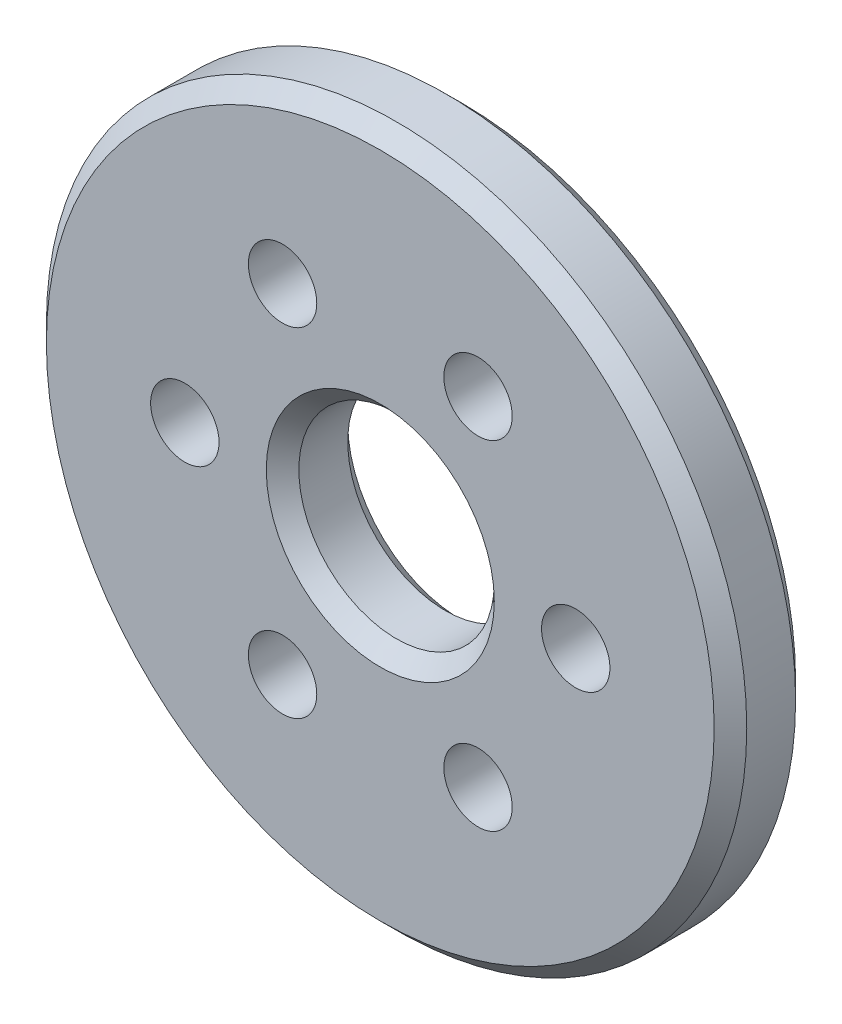
ISO-10303-21;
HEADER;
FILE_DESCRIPTION(('STEP AP214'),'2;1');
FILE_NAME('part.step','',(''),(''),'','','');
FILE_SCHEMA(('AUTOMOTIVE_DESIGN { 1 0 10303 214 1 1 1 1 }'));
ENDSEC;
DATA;
#1=APPLICATION_CONTEXT('core data for automotive mechanical design processes');
#2=APPLICATION_PROTOCOL_DEFINITION('international standard','automotive_design',2000,#1);
#3=PRODUCT_CONTEXT('',#1,'mechanical');
#4=PRODUCT('Part','Part','',(#3));
#5=PRODUCT_RELATED_PRODUCT_CATEGORY('part','',(#4));
#6=PRODUCT_DEFINITION_FORMATION('','',#4);
#7=PRODUCT_DEFINITION_CONTEXT('part definition',#1,'design');
#8=PRODUCT_DEFINITION('design','',#6,#7);
#9=PRODUCT_DEFINITION_SHAPE('','',#8);
#10=(LENGTH_UNIT() NAMED_UNIT(*) SI_UNIT(.MILLI.,.METRE.));
#11=(NAMED_UNIT(*) PLANE_ANGLE_UNIT() SI_UNIT($,.RADIAN.));
#12=(NAMED_UNIT(*) SI_UNIT($,.STERADIAN.) SOLID_ANGLE_UNIT());
#13=UNCERTAINTY_MEASURE_WITH_UNIT(LENGTH_MEASURE(1.E-05),#10,'distance_accuracy_value','');
#14=(GEOMETRIC_REPRESENTATION_CONTEXT(3) GLOBAL_UNCERTAINTY_ASSIGNED_CONTEXT((#13)) GLOBAL_UNIT_ASSIGNED_CONTEXT((#10,
#11,#12)) REPRESENTATION_CONTEXT('',''));
#15=CARTESIAN_POINT('',(0.,0.,0.));
#16=DIRECTION('',(0.,0.,1.));
#17=DIRECTION('',(1.,0.,0.));
#18=AXIS2_PLACEMENT_3D('',#15,#16,#17);
#19=CARTESIAN_POINT('',(0.,0.,5.));
#20=DIRECTION('',(0.,0.,1.));
#21=DIRECTION('',(1.,0.,0.));
#22=AXIS2_PLACEMENT_3D('',#19,#20,#21);
#23=PLANE('',#22);
#24=CARTESIAN_POINT('',(0.,0.,5.));
#25=DIRECTION('',(0.,0.,1.));
#26=DIRECTION('',(1.,0.,0.));
#27=AXIS2_PLACEMENT_3D('',#24,#25,#26);
#28=CIRCLE('',#27,7.00000000000001);
#29=CARTESIAN_POINT('',(7.00000000000001,0.,5.));
#30=VERTEX_POINT('',#29);
#31=EDGE_CURVE('E61',#30,#30,#28,.F.);
#32=ORIENTED_EDGE('',*,*,#31,.T.);
#33=EDGE_LOOP('',(#32));
#34=FACE_BOUND('',#33,.T.);
#35=CARTESIAN_POINT('',(0.,0.,5.));
#36=DIRECTION('',(0.,0.,1.));
#37=DIRECTION('',(1.,0.,0.));
#38=AXIS2_PLACEMENT_3D('',#35,#36,#37);
#39=CIRCLE('',#38,20.5);
#40=CARTESIAN_POINT('',(20.5,0.,5.));
#41=VERTEX_POINT('',#40);
#42=EDGE_CURVE('E67',#41,#41,#39,.T.);
#43=ORIENTED_EDGE('',*,*,#42,.T.);
#44=EDGE_LOOP('',(#43));
#45=FACE_BOUND('',#44,.T.);
#46=CARTESIAN_POINT('',(-5.9999999999999,10.3923048454133,5.));
#47=DIRECTION('',(0.,0.,1.));
#48=DIRECTION('',(1.,0.,0.));
#49=AXIS2_PLACEMENT_3D('',#46,#47,#48);
#50=CIRCLE('',#49,2.1);
#51=CARTESIAN_POINT('',(-3.89999999999991,10.3923048454133,5.));
#52=VERTEX_POINT('',#51);
#53=EDGE_CURVE('E116',#52,#52,#50,.T.);
#54=ORIENTED_EDGE('',*,*,#53,.F.);
#55=EDGE_LOOP('',(#54));
#56=FACE_BOUND('',#55,.T.);
#57=CARTESIAN_POINT('',(-6.00000000000005,-10.3923048454132,5.));
#58=DIRECTION('',(0.,0.,1.));
#59=DIRECTION('',(1.,0.,0.));
#60=AXIS2_PLACEMENT_3D('',#57,#58,#59);
#61=CIRCLE('',#60,2.1);
#62=CARTESIAN_POINT('',(-3.90000000000005,-10.3923048454132,5.));
#63=VERTEX_POINT('',#62);
#64=EDGE_CURVE('E101',#63,#63,#61,.T.);
#65=ORIENTED_EDGE('',*,*,#64,.F.);
#66=EDGE_LOOP('',(#65));
#67=FACE_BOUND('',#66,.T.);
#68=CARTESIAN_POINT('',(12.,0.,5.));
#69=DIRECTION('',(0.,0.,1.));
#70=DIRECTION('',(1.,0.,0.));
#71=AXIS2_PLACEMENT_3D('',#68,#69,#70);
#72=CIRCLE('',#71,2.1);
#73=CARTESIAN_POINT('',(14.1,0.,5.));
#74=VERTEX_POINT('',#73);
#75=EDGE_CURVE('E88',#74,#74,#72,.T.);
#76=ORIENTED_EDGE('',*,*,#75,.F.);
#77=EDGE_LOOP('',(#76));
#78=FACE_BOUND('',#77,.T.);
#79=CARTESIAN_POINT('',(5.99999999999998,-10.3923048454133,5.));
#80=DIRECTION('',(0.,0.,1.));
#81=DIRECTION('',(1.,0.,0.));
#82=AXIS2_PLACEMENT_3D('',#79,#80,#81);
#83=CIRCLE('',#82,2.1);
#84=CARTESIAN_POINT('',(8.09999999999997,-10.3923048454133,5.));
#85=VERTEX_POINT('',#84);
#86=EDGE_CURVE('E93',#85,#85,#83,.T.);
#87=ORIENTED_EDGE('',*,*,#86,.F.);
#88=EDGE_LOOP('',(#87));
#89=FACE_BOUND('',#88,.T.);
#90=CARTESIAN_POINT('',(-12.,0.,5.));
#91=DIRECTION('',(0.,0.,1.));
#92=DIRECTION('',(1.,0.,0.));
#93=AXIS2_PLACEMENT_3D('',#90,#91,#92);
#94=CIRCLE('',#93,2.1);
#95=CARTESIAN_POINT('',(-9.9,0.,5.));
#96=VERTEX_POINT('',#95);
#97=EDGE_CURVE('E108',#96,#96,#94,.T.);
#98=ORIENTED_EDGE('',*,*,#97,.F.);
#99=EDGE_LOOP('',(#98));
#100=FACE_BOUND('',#99,.T.);
#101=CARTESIAN_POINT('',(6.00000000000012,10.3923048454132,5.));
#102=DIRECTION('',(0.,0.,1.));
#103=DIRECTION('',(1.,0.,0.));
#104=AXIS2_PLACEMENT_3D('',#101,#102,#103);
#105=CIRCLE('',#104,2.1);
#106=CARTESIAN_POINT('',(8.10000000000012,10.3923048454132,5.));
#107=VERTEX_POINT('',#106);
#108=EDGE_CURVE('E124',#107,#107,#105,.T.);
#109=ORIENTED_EDGE('',*,*,#108,.F.);
#110=EDGE_LOOP('',(#109));
#111=FACE_BOUND('',#110,.T.);
#112=ADVANCED_FACE('F45',(#34,#45,#56,#67,#78,#89,#100,#111),#23,.T.);
#113=CARTESIAN_POINT('',(0.,0.,0.));
#114=DIRECTION('',(0.,0.,1.));
#115=DIRECTION('',(1.,0.,0.));
#116=AXIS2_PLACEMENT_3D('',#113,#114,#115);
#117=PLANE('',#116);
#118=CARTESIAN_POINT('',(0.,0.,0.));
#119=DIRECTION('',(0.,0.,1.));
#120=DIRECTION('',(1.,0.,0.));
#121=AXIS2_PLACEMENT_3D('',#118,#119,#120);
#122=CIRCLE('',#121,7.);
#123=CARTESIAN_POINT('',(7.,0.,0.));
#124=VERTEX_POINT('',#123);
#125=EDGE_CURVE('E80',#124,#124,#122,.T.);
#126=ORIENTED_EDGE('',*,*,#125,.T.);
#127=EDGE_LOOP('',(#126));
#128=FACE_BOUND('',#127,.T.);
#129=CARTESIAN_POINT('',(0.,0.,0.));
#130=DIRECTION('',(0.,0.,1.));
#131=DIRECTION('',(1.,0.,0.));
#132=AXIS2_PLACEMENT_3D('',#129,#130,#131);
#133=CIRCLE('',#132,20.5);
#134=CARTESIAN_POINT('',(20.5,0.,0.));
#135=VERTEX_POINT('',#134);
#136=EDGE_CURVE('E84',#135,#135,#133,.F.);
#137=ORIENTED_EDGE('',*,*,#136,.T.);
#138=EDGE_LOOP('',(#137));
#139=FACE_BOUND('',#138,.T.);
#140=CARTESIAN_POINT('',(12.,0.,0.));
#141=DIRECTION('',(0.,0.,1.));
#142=DIRECTION('',(1.,0.,0.));
#143=AXIS2_PLACEMENT_3D('',#140,#141,#142);
#144=CIRCLE('',#143,2.1);
#145=CARTESIAN_POINT('',(14.1,0.,0.));
#146=VERTEX_POINT('',#145);
#147=EDGE_CURVE('E89',#146,#146,#144,.T.);
#148=ORIENTED_EDGE('',*,*,#147,.T.);
#149=EDGE_LOOP('',(#148));
#150=FACE_BOUND('',#149,.T.);
#151=CARTESIAN_POINT('',(5.99999999999998,-10.3923048454133,0.));
#152=DIRECTION('',(0.,0.,1.));
#153=DIRECTION('',(1.,0.,0.));
#154=AXIS2_PLACEMENT_3D('',#151,#152,#153);
#155=CIRCLE('',#154,2.1);
#156=CARTESIAN_POINT('',(8.09999999999997,-10.3923048454133,0.));
#157=VERTEX_POINT('',#156);
#158=EDGE_CURVE('E97',#157,#157,#155,.T.);
#159=ORIENTED_EDGE('',*,*,#158,.T.);
#160=EDGE_LOOP('',(#159));
#161=FACE_BOUND('',#160,.T.);
#162=CARTESIAN_POINT('',(-6.00000000000005,-10.3923048454132,0.));
#163=DIRECTION('',(0.,0.,1.));
#164=DIRECTION('',(1.,0.,0.));
#165=AXIS2_PLACEMENT_3D('',#162,#163,#164);
#166=CIRCLE('',#165,2.1);
#167=CARTESIAN_POINT('',(-3.90000000000005,-10.3923048454132,0.));
#168=VERTEX_POINT('',#167);
#169=EDGE_CURVE('E104',#168,#168,#166,.T.);
#170=ORIENTED_EDGE('',*,*,#169,.T.);
#171=EDGE_LOOP('',(#170));
#172=FACE_BOUND('',#171,.T.);
#173=CARTESIAN_POINT('',(-12.,0.,0.));
#174=DIRECTION('',(0.,0.,1.));
#175=DIRECTION('',(1.,0.,0.));
#176=AXIS2_PLACEMENT_3D('',#173,#174,#175);
#177=CIRCLE('',#176,2.1);
#178=CARTESIAN_POINT('',(-9.9,0.,0.));
#179=VERTEX_POINT('',#178);
#180=EDGE_CURVE('E112',#179,#179,#177,.T.);
#181=ORIENTED_EDGE('',*,*,#180,.T.);
#182=EDGE_LOOP('',(#181));
#183=FACE_BOUND('',#182,.T.);
#184=CARTESIAN_POINT('',(-5.9999999999999,10.3923048454133,0.));
#185=DIRECTION('',(0.,0.,1.));
#186=DIRECTION('',(1.,0.,0.));
#187=AXIS2_PLACEMENT_3D('',#184,#185,#186);
#188=CIRCLE('',#187,2.1);
#189=CARTESIAN_POINT('',(-3.89999999999991,10.3923048454133,0.));
#190=VERTEX_POINT('',#189);
#191=EDGE_CURVE('E120',#190,#190,#188,.T.);
#192=ORIENTED_EDGE('',*,*,#191,.T.);
#193=EDGE_LOOP('',(#192));
#194=FACE_BOUND('',#193,.T.);
#195=CARTESIAN_POINT('',(6.00000000000012,10.3923048454132,0.));
#196=DIRECTION('',(0.,0.,1.));
#197=DIRECTION('',(1.,0.,0.));
#198=AXIS2_PLACEMENT_3D('',#195,#196,#197);
#199=CIRCLE('',#198,2.1);
#200=CARTESIAN_POINT('',(8.10000000000012,10.3923048454132,0.));
#201=VERTEX_POINT('',#200);
#202=EDGE_CURVE('E127',#201,#201,#199,.T.);
#203=ORIENTED_EDGE('',*,*,#202,.T.);
#204=EDGE_LOOP('',(#203));
#205=FACE_BOUND('',#204,.T.);
#206=ADVANCED_FACE('F139',(#128,#139,#150,#161,#172,#183,#194,#205),#117,.F.);
#207=CARTESIAN_POINT('',(0.,0.,5.));
#208=DIRECTION('',(0.,0.,-1.));
#209=DIRECTION('',(-1.,0.,0.));
#210=AXIS2_PLACEMENT_3D('',#207,#208,#209);
#211=CYLINDRICAL_SURFACE('',#210,21.5);
#212=CARTESIAN_POINT('',(0.,0.,1.));
#213=DIRECTION('',(0.,0.,1.));
#214=DIRECTION('',(1.,0.,0.));
#215=AXIS2_PLACEMENT_3D('',#212,#213,#214);
#216=CIRCLE('',#215,21.5);
#217=CARTESIAN_POINT('',(21.5,0.,1.));
#218=VERTEX_POINT('',#217);
#219=EDGE_CURVE('E10',#218,#218,#216,.T.);
#220=ORIENTED_EDGE('',*,*,#219,.T.);
#221=EDGE_LOOP('',(#220));
#222=FACE_BOUND('',#221,.T.);
#223=CARTESIAN_POINT('',(0.,0.,4.00000000000001));
#224=DIRECTION('',(0.,0.,1.));
#225=DIRECTION('',(1.,0.,0.));
#226=AXIS2_PLACEMENT_3D('',#223,#224,#225);
#227=CIRCLE('',#226,21.5);
#228=CARTESIAN_POINT('',(21.5,0.,4.00000000000001));
#229=VERTEX_POINT('',#228);
#230=EDGE_CURVE('E54',#229,#229,#227,.F.);
#231=ORIENTED_EDGE('',*,*,#230,.T.);
#232=EDGE_LOOP('',(#231));
#233=FACE_BOUND('',#232,.T.);
#234=ADVANCED_FACE('F144',(#222,#233),#211,.T.);
#235=CARTESIAN_POINT('',(12.,0.,5.));
#236=DIRECTION('',(0.,0.,-1.));
#237=DIRECTION('',(-1.,0.,0.));
#238=AXIS2_PLACEMENT_3D('',#235,#236,#237);
#239=CYLINDRICAL_SURFACE('',#238,2.1);
#240=ORIENTED_EDGE('',*,*,#75,.T.);
#241=EDGE_LOOP('',(#240));
#242=FACE_BOUND('',#241,.T.);
#243=ORIENTED_EDGE('',*,*,#147,.F.);
#244=EDGE_LOOP('',(#243));
#245=FACE_BOUND('',#244,.T.);
#246=ADVANCED_FACE('F149',(#242,#245),#239,.F.);
#247=CARTESIAN_POINT('',(0.,0.,5.));
#248=DIRECTION('',(0.,0.,-1.));
#249=DIRECTION('',(-1.,0.,0.));
#250=AXIS2_PLACEMENT_3D('',#247,#248,#249);
#251=CYLINDRICAL_SURFACE('',#250,6.);
#252=CARTESIAN_POINT('',(0.,0.,0.999999999999997));
#253=DIRECTION('',(0.,0.,1.));
#254=DIRECTION('',(1.,0.,0.));
#255=AXIS2_PLACEMENT_3D('',#252,#253,#254);
#256=CIRCLE('',#255,6.);
#257=CARTESIAN_POINT('',(6.,0.,0.999999999999997));
#258=VERTEX_POINT('',#257);
#259=EDGE_CURVE('E73',#258,#258,#256,.F.);
#260=ORIENTED_EDGE('',*,*,#259,.T.);
#261=EDGE_LOOP('',(#260));
#262=FACE_BOUND('',#261,.T.);
#263=CARTESIAN_POINT('',(0.,0.,4.));
#264=DIRECTION('',(0.,0.,1.));
#265=DIRECTION('',(1.,0.,0.));
#266=AXIS2_PLACEMENT_3D('',#263,#264,#265);
#267=CIRCLE('',#266,6.);
#268=CARTESIAN_POINT('',(6.,0.,4.));
#269=VERTEX_POINT('',#268);
#270=EDGE_CURVE('E76',#269,#269,#267,.T.);
#271=ORIENTED_EDGE('',*,*,#270,.T.);
#272=EDGE_LOOP('',(#271));
#273=FACE_BOUND('',#272,.T.);
#274=ADVANCED_FACE('F209',(#262,#273),#251,.F.);
#275=CARTESIAN_POINT('',(5.99999999999998,-10.3923048454133,5.));
#276=DIRECTION('',(0.,0.,-1.));
#277=DIRECTION('',(-1.,0.,0.));
#278=AXIS2_PLACEMENT_3D('',#275,#276,#277);
#279=CYLINDRICAL_SURFACE('',#278,2.1);
#280=ORIENTED_EDGE('',*,*,#86,.T.);
#281=EDGE_LOOP('',(#280));
#282=FACE_BOUND('',#281,.T.);
#283=ORIENTED_EDGE('',*,*,#158,.F.);
#284=EDGE_LOOP('',(#283));
#285=FACE_BOUND('',#284,.T.);
#286=ADVANCED_FACE('F206',(#282,#285),#279,.F.);
#287=CARTESIAN_POINT('',(-6.00000000000005,-10.3923048454132,5.));
#288=DIRECTION('',(0.,0.,-1.));
#289=DIRECTION('',(-1.,0.,0.));
#290=AXIS2_PLACEMENT_3D('',#287,#288,#289);
#291=CYLINDRICAL_SURFACE('',#290,2.1);
#292=ORIENTED_EDGE('',*,*,#64,.T.);
#293=EDGE_LOOP('',(#292));
#294=FACE_BOUND('',#293,.T.);
#295=ORIENTED_EDGE('',*,*,#169,.F.);
#296=EDGE_LOOP('',(#295));
#297=FACE_BOUND('',#296,.T.);
#298=ADVANCED_FACE('F202',(#294,#297),#291,.F.);
#299=CARTESIAN_POINT('',(-12.,0.,5.));
#300=DIRECTION('',(0.,0.,-1.));
#301=DIRECTION('',(-1.,0.,0.));
#302=AXIS2_PLACEMENT_3D('',#299,#300,#301);
#303=CYLINDRICAL_SURFACE('',#302,2.1);
#304=ORIENTED_EDGE('',*,*,#97,.T.);
#305=EDGE_LOOP('',(#304));
#306=FACE_BOUND('',#305,.T.);
#307=ORIENTED_EDGE('',*,*,#180,.F.);
#308=EDGE_LOOP('',(#307));
#309=FACE_BOUND('',#308,.T.);
#310=ADVANCED_FACE('F196',(#306,#309),#303,.F.);
#311=CARTESIAN_POINT('',(-5.9999999999999,10.3923048454133,5.));
#312=DIRECTION('',(0.,0.,-1.));
#313=DIRECTION('',(-1.,0.,0.));
#314=AXIS2_PLACEMENT_3D('',#311,#312,#313);
#315=CYLINDRICAL_SURFACE('',#314,2.1);
#316=ORIENTED_EDGE('',*,*,#53,.T.);
#317=EDGE_LOOP('',(#316));
#318=FACE_BOUND('',#317,.T.);
#319=ORIENTED_EDGE('',*,*,#191,.F.);
#320=EDGE_LOOP('',(#319));
#321=FACE_BOUND('',#320,.T.);
#322=ADVANCED_FACE('F192',(#318,#321),#315,.F.);
#323=CARTESIAN_POINT('',(6.00000000000012,10.3923048454132,5.));
#324=DIRECTION('',(0.,0.,-1.));
#325=DIRECTION('',(-1.,0.,0.));
#326=AXIS2_PLACEMENT_3D('',#323,#324,#325);
#327=CYLINDRICAL_SURFACE('',#326,2.1);
#328=ORIENTED_EDGE('',*,*,#108,.T.);
#329=EDGE_LOOP('',(#328));
#330=FACE_BOUND('',#329,.T.);
#331=ORIENTED_EDGE('',*,*,#202,.F.);
#332=EDGE_LOOP('',(#331));
#333=FACE_BOUND('',#332,.T.);
#334=ADVANCED_FACE('F135',(#330,#333),#327,.F.);
#335=CARTESIAN_POINT('',(0.,0.,0.));
#336=DIRECTION('',(0.,0.,-1.));
#337=DIRECTION('',(-1.,0.,0.));
#338=AXIS2_PLACEMENT_3D('',#335,#336,#337);
#339=CONICAL_SURFACE('',#338,7.,0.785398163397449);
#340=ORIENTED_EDGE('',*,*,#259,.F.);
#341=EDGE_LOOP('',(#340));
#342=FACE_BOUND('',#341,.T.);
#343=ORIENTED_EDGE('',*,*,#125,.F.);
#344=EDGE_LOOP('',(#343));
#345=FACE_BOUND('',#344,.T.);
#346=ADVANCED_FACE('F155',(#342,#345),#339,.F.);
#347=CARTESIAN_POINT('',(0.,0.,4.));
#348=DIRECTION('',(0.,0.,1.));
#349=DIRECTION('',(1.,0.,0.));
#350=AXIS2_PLACEMENT_3D('',#347,#348,#349);
#351=CONICAL_SURFACE('',#350,6.,0.785398163397452);
#352=ORIENTED_EDGE('',*,*,#31,.F.);
#353=EDGE_LOOP('',(#352));
#354=FACE_BOUND('',#353,.T.);
#355=ORIENTED_EDGE('',*,*,#270,.F.);
#356=EDGE_LOOP('',(#355));
#357=FACE_BOUND('',#356,.T.);
#358=ADVANCED_FACE('F161',(#354,#357),#351,.F.);
#359=CARTESIAN_POINT('',(0.,0.,1.));
#360=DIRECTION('',(0.,0.,1.));
#361=DIRECTION('',(1.,0.,0.));
#362=AXIS2_PLACEMENT_3D('',#359,#360,#361);
#363=CONICAL_SURFACE('',#362,21.5,0.785398163397447);
#364=ORIENTED_EDGE('',*,*,#136,.F.);
#365=EDGE_LOOP('',(#364));
#366=FACE_BOUND('',#365,.T.);
#367=ORIENTED_EDGE('',*,*,#219,.F.);
#368=EDGE_LOOP('',(#367));
#369=FACE_BOUND('',#368,.T.);
#370=ADVANCED_FACE('F167',(#366,#369),#363,.T.);
#371=CARTESIAN_POINT('',(0.,0.,5.));
#372=DIRECTION('',(0.,0.,-1.));
#373=DIRECTION('',(-1.,0.,0.));
#374=AXIS2_PLACEMENT_3D('',#371,#372,#373);
#375=CONICAL_SURFACE('',#374,20.5,0.785398163397447);
#376=ORIENTED_EDGE('',*,*,#230,.F.);
#377=EDGE_LOOP('',(#376));
#378=FACE_BOUND('',#377,.T.);
#379=ORIENTED_EDGE('',*,*,#42,.F.);
#380=EDGE_LOOP('',(#379));
#381=FACE_BOUND('',#380,.T.);
#382=ADVANCED_FACE('F48',(#378,#381),#375,.T.);
#383=CLOSED_SHELL('',(#112,#206,#234,#246,#274,#286,#298,#310,#322,#334,#346,#358,#370,#382));
#384=MANIFOLD_SOLID_BREP('B2',#383);
#385=ADVANCED_BREP_SHAPE_REPRESENTATION('',(#18,#384),#14);
#386=SHAPE_DEFINITION_REPRESENTATION(#9,#385);
ENDSEC;
END-ISO-10303-21;
